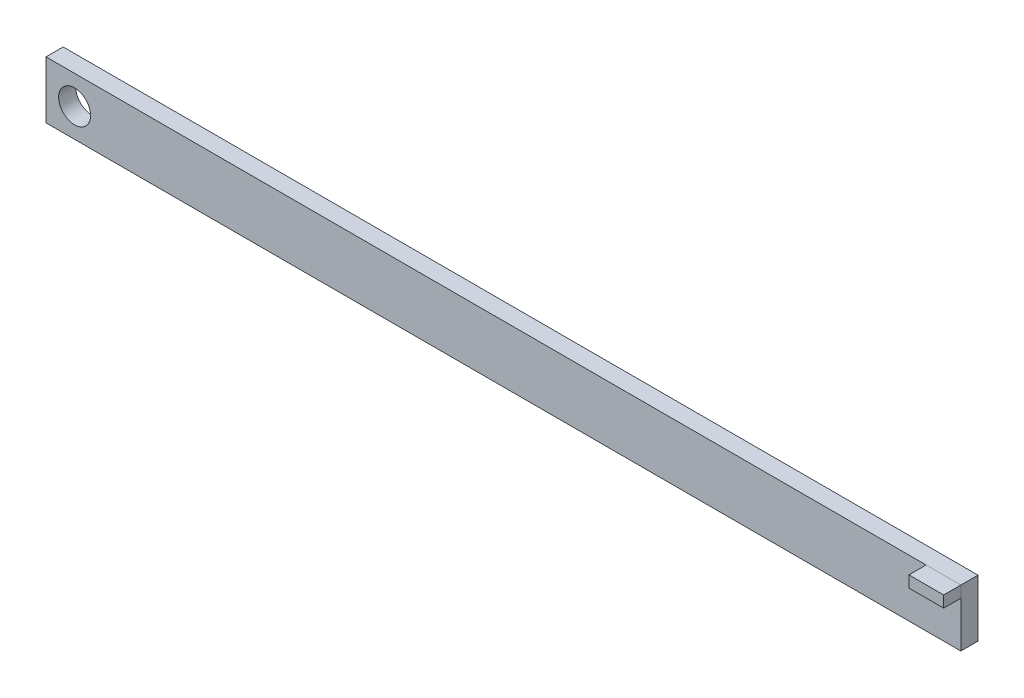
ISO-10303-21;
HEADER;
FILE_DESCRIPTION(('STEP AP214'),'2;1');
FILE_NAME('part.step','',(''),(''),'','','');
FILE_SCHEMA(('AUTOMOTIVE_DESIGN { 1 0 10303 214 1 1 1 1 }'));
ENDSEC;
DATA;
#1=APPLICATION_CONTEXT('core data for automotive mechanical design processes');
#2=APPLICATION_PROTOCOL_DEFINITION('international standard','automotive_design',2000,#1);
#3=PRODUCT_CONTEXT('',#1,'mechanical');
#4=PRODUCT('Part','Part','',(#3));
#5=PRODUCT_RELATED_PRODUCT_CATEGORY('part','',(#4));
#6=PRODUCT_DEFINITION_FORMATION('','',#4);
#7=PRODUCT_DEFINITION_CONTEXT('part definition',#1,'design');
#8=PRODUCT_DEFINITION('design','',#6,#7);
#9=PRODUCT_DEFINITION_SHAPE('','',#8);
#10=(LENGTH_UNIT() NAMED_UNIT(*) SI_UNIT(.MILLI.,.METRE.));
#11=(NAMED_UNIT(*) PLANE_ANGLE_UNIT() SI_UNIT($,.RADIAN.));
#12=(NAMED_UNIT(*) SI_UNIT($,.STERADIAN.) SOLID_ANGLE_UNIT());
#13=UNCERTAINTY_MEASURE_WITH_UNIT(LENGTH_MEASURE(1.E-05),#10,'distance_accuracy_value','');
#14=(GEOMETRIC_REPRESENTATION_CONTEXT(3) GLOBAL_UNCERTAINTY_ASSIGNED_CONTEXT((#13)) GLOBAL_UNIT_ASSIGNED_CONTEXT((#10,
#11,#12)) REPRESENTATION_CONTEXT('',''));
#15=CARTESIAN_POINT('',(0.,0.,0.));
#16=DIRECTION('',(0.,0.,1.));
#17=DIRECTION('',(1.,0.,0.));
#18=AXIS2_PLACEMENT_3D('',#15,#16,#17);
#19=CARTESIAN_POINT('',(0.,26.,95.9));
#20=DIRECTION('',(0.,-1.,0.));
#21=DIRECTION('',(1.,0.,0.));
#22=AXIS2_PLACEMENT_3D('',#19,#20,#21);
#23=PLANE('',#22);
#24=DIRECTION('',(-1.,0.,0.));
#25=VECTOR('',#24,1.);
#26=CARTESIAN_POINT('',(0.,26.,92.9));
#27=LINE('',#26,#25);
#28=CARTESIAN_POINT('',(220.,26.,92.9));
#29=VERTEX_POINT('',#28);
#30=CARTESIAN_POINT('',(213.922074633376,26.,92.9));
#31=VERTEX_POINT('',#30);
#32=EDGE_CURVE('E108',#29,#31,#27,.T.);
#33=ORIENTED_EDGE('',*,*,#32,.T.);
#34=DIRECTION('',(0.,0.,-1.));
#35=VECTOR('',#34,1.);
#36=CARTESIAN_POINT('',(213.922074633376,26.,95.9));
#37=LINE('',#36,#35);
#38=CARTESIAN_POINT('',(213.922074633376,26.,95.9));
#39=VERTEX_POINT('',#38);
#40=EDGE_CURVE('E12',#39,#31,#37,.T.);
#41=ORIENTED_EDGE('',*,*,#40,.F.);
#42=DIRECTION('',(-1.,0.,0.));
#43=VECTOR('',#42,1.);
#44=CARTESIAN_POINT('',(0.,26.,95.9));
#45=LINE('',#44,#43);
#46=CARTESIAN_POINT('',(220.,26.,95.9));
#47=VERTEX_POINT('',#46);
#48=EDGE_CURVE('E96',#47,#39,#45,.T.);
#49=ORIENTED_EDGE('',*,*,#48,.F.);
#50=DIRECTION('',(0.,0.,-1.));
#51=VECTOR('',#50,1.);
#52=CARTESIAN_POINT('',(220.,26.,95.9));
#53=LINE('',#52,#51);
#54=EDGE_CURVE('E104',#47,#29,#53,.T.);
#55=ORIENTED_EDGE('',*,*,#54,.T.);
#56=EDGE_LOOP('',(#33,#41,#49,#55));
#57=FACE_BOUND('',#56,.T.);
#58=ADVANCED_FACE('F45',(#57),#23,.F.);
#59=CARTESIAN_POINT('',(213.922074633376,0.,95.9));
#60=DIRECTION('',(1.,0.,0.));
#61=DIRECTION('',(0.,0.,-1.));
#62=AXIS2_PLACEMENT_3D('',#59,#60,#61);
#63=PLANE('',#62);
#64=DIRECTION('',(0.,-1.,0.));
#65=VECTOR('',#64,1.);
#66=CARTESIAN_POINT('',(213.922074633376,0.,92.9));
#67=LINE('',#66,#65);
#68=CARTESIAN_POINT('',(213.922074633376,24.,92.9));
#69=VERTEX_POINT('',#68);
#70=EDGE_CURVE('E100',#31,#69,#67,.T.);
#71=ORIENTED_EDGE('',*,*,#70,.T.);
#72=DIRECTION('',(0.,0.,-1.));
#73=VECTOR('',#72,1.);
#74=CARTESIAN_POINT('',(213.922074633376,24.,95.9));
#75=LINE('',#74,#73);
#76=CARTESIAN_POINT('',(213.922074633376,24.,95.9));
#77=VERTEX_POINT('',#76);
#78=EDGE_CURVE('E53',#77,#69,#75,.T.);
#79=ORIENTED_EDGE('',*,*,#78,.F.);
#80=DIRECTION('',(0.,-1.,0.));
#81=VECTOR('',#80,1.);
#82=CARTESIAN_POINT('',(213.922074633376,0.,95.9));
#83=LINE('',#82,#81);
#84=EDGE_CURVE('E91',#39,#77,#83,.T.);
#85=ORIENTED_EDGE('',*,*,#84,.F.);
#86=ORIENTED_EDGE('',*,*,#40,.T.);
#87=EDGE_LOOP('',(#71,#79,#85,#86));
#88=FACE_BOUND('',#87,.T.);
#89=ADVANCED_FACE('F99',(#88),#63,.F.);
#90=CARTESIAN_POINT('',(0.,24.,95.9));
#91=DIRECTION('',(0.,1.,0.));
#92=DIRECTION('',(0.,0.,1.));
#93=AXIS2_PLACEMENT_3D('',#90,#91,#92);
#94=PLANE('',#93);
#95=DIRECTION('',(1.,0.,0.));
#96=VECTOR('',#95,1.);
#97=CARTESIAN_POINT('',(0.,24.,92.9));
#98=LINE('',#97,#96);
#99=CARTESIAN_POINT('',(220.,24.,92.9));
#100=VERTEX_POINT('',#99);
#101=EDGE_CURVE('E78',#69,#100,#98,.T.);
#102=ORIENTED_EDGE('',*,*,#101,.T.);
#103=DIRECTION('',(0.,0.,-1.));
#104=VECTOR('',#103,1.);
#105=CARTESIAN_POINT('',(220.,24.,95.9));
#106=LINE('',#105,#104);
#107=CARTESIAN_POINT('',(220.,24.,95.9));
#108=VERTEX_POINT('',#107);
#109=EDGE_CURVE('E101',#108,#100,#106,.T.);
#110=ORIENTED_EDGE('',*,*,#109,.F.);
#111=DIRECTION('',(1.,0.,0.));
#112=VECTOR('',#111,1.);
#113=CARTESIAN_POINT('',(0.,24.,95.9));
#114=LINE('',#113,#112);
#115=EDGE_CURVE('E94',#77,#108,#114,.T.);
#116=ORIENTED_EDGE('',*,*,#115,.F.);
#117=ORIENTED_EDGE('',*,*,#78,.T.);
#118=EDGE_LOOP('',(#102,#110,#116,#117));
#119=FACE_BOUND('',#118,.T.);
#120=ADVANCED_FACE('F102',(#119),#94,.F.);
#121=CARTESIAN_POINT('',(220.,0.,95.9));
#122=DIRECTION('',(-1.,0.,0.));
#123=DIRECTION('',(0.,0.,1.));
#124=AXIS2_PLACEMENT_3D('',#121,#122,#123);
#125=PLANE('',#124);
#126=DIRECTION('',(0.,1.,0.));
#127=VECTOR('',#126,1.);
#128=CARTESIAN_POINT('',(220.,0.,92.9));
#129=LINE('',#128,#127);
#130=EDGE_CURVE('E84',#100,#29,#129,.T.);
#131=ORIENTED_EDGE('',*,*,#130,.T.);
#132=ORIENTED_EDGE('',*,*,#54,.F.);
#133=DIRECTION('',(0.,1.,0.));
#134=VECTOR('',#133,1.);
#135=CARTESIAN_POINT('',(220.,0.,95.9));
#136=LINE('',#135,#134);
#137=EDGE_CURVE('E61',#108,#47,#136,.T.);
#138=ORIENTED_EDGE('',*,*,#137,.F.);
#139=ORIENTED_EDGE('',*,*,#109,.T.);
#140=EDGE_LOOP('',(#131,#132,#138,#139));
#141=FACE_BOUND('',#140,.T.);
#142=ADVANCED_FACE('F115',(#141),#125,.F.);
#143=CARTESIAN_POINT('',(0.,0.,95.9));
#144=DIRECTION('',(0.,0.,1.));
#145=DIRECTION('',(1.,0.,0.));
#146=AXIS2_PLACEMENT_3D('',#143,#144,#145);
#147=PLANE('',#146);
#148=ORIENTED_EDGE('',*,*,#48,.T.);
#149=ORIENTED_EDGE('',*,*,#84,.T.);
#150=ORIENTED_EDGE('',*,*,#115,.T.);
#151=ORIENTED_EDGE('',*,*,#137,.T.);
#152=EDGE_LOOP('',(#148,#149,#150,#151));
#153=FACE_BOUND('',#152,.T.);
#154=ADVANCED_FACE('F92',(#153),#147,.T.);
#155=CARTESIAN_POINT('',(0.,0.,92.9));
#156=DIRECTION('',(0.,0.,1.));
#157=DIRECTION('',(1.,0.,0.));
#158=AXIS2_PLACEMENT_3D('',#155,#156,#157);
#159=PLANE('',#158);
#160=ORIENTED_EDGE('',*,*,#32,.F.);
#161=ORIENTED_EDGE('',*,*,#130,.F.);
#162=ORIENTED_EDGE('',*,*,#101,.F.);
#163=ORIENTED_EDGE('',*,*,#70,.F.);
#164=EDGE_LOOP('',(#160,#161,#162,#163));
#165=FACE_BOUND('',#164,.T.);
#166=ADVANCED_FACE('F118',(#165),#159,.F.);
#167=CLOSED_SHELL('',(#58,#89,#120,#142,#154,#166));
#168=MANIFOLD_SOLID_BREP('B2',#167);
#169=CARTESIAN_POINT('',(0.,0.,92.9));
#170=DIRECTION('',(0.,0.,-1.));
#171=DIRECTION('',(-1.,0.,0.));
#172=AXIS2_PLACEMENT_3D('',#169,#170,#171);
#173=PLANE('',#172);
#174=DIRECTION('',(0.,1.,0.));
#175=VECTOR('',#174,1.);
#176=CARTESIAN_POINT('',(220.,16.,92.9));
#177=LINE('',#176,#175);
#178=CARTESIAN_POINT('',(220.,16.,92.9));
#179=VERTEX_POINT('',#178);
#180=CARTESIAN_POINT('',(220.,26.,92.9));
#181=VERTEX_POINT('',#180);
#182=EDGE_CURVE('E226',#179,#181,#177,.T.);
#183=ORIENTED_EDGE('',*,*,#182,.T.);
#184=DIRECTION('',(-1.,0.,0.));
#185=VECTOR('',#184,1.);
#186=CARTESIAN_POINT('',(65.,26.,92.9));
#187=LINE('',#186,#185);
#188=CARTESIAN_POINT('',(60.,26.,92.9));
#189=VERTEX_POINT('',#188);
#190=EDGE_CURVE('E220',#181,#189,#187,.T.);
#191=ORIENTED_EDGE('',*,*,#190,.T.);
#192=DIRECTION('',(0.,-1.,0.));
#193=VECTOR('',#192,1.);
#194=CARTESIAN_POINT('',(60.,16.,92.9));
#195=LINE('',#194,#193);
#196=CARTESIAN_POINT('',(60.,16.,92.9));
#197=VERTEX_POINT('',#196);
#198=EDGE_CURVE('E223',#189,#197,#195,.T.);
#199=ORIENTED_EDGE('',*,*,#198,.T.);
#200=DIRECTION('',(1.,0.,0.));
#201=VECTOR('',#200,1.);
#202=CARTESIAN_POINT('',(65.,16.,92.9));
#203=LINE('',#202,#201);
#204=EDGE_CURVE('E192',#197,#179,#203,.T.);
#205=ORIENTED_EDGE('',*,*,#204,.T.);
#206=EDGE_LOOP('',(#183,#191,#199,#205));
#207=FACE_BOUND('',#206,.T.);
#208=CARTESIAN_POINT('',(65.,21.,92.9));
#209=DIRECTION('',(0.,0.,1.));
#210=DIRECTION('',(1.,0.,0.));
#211=AXIS2_PLACEMENT_3D('',#208,#209,#210);
#212=CIRCLE('',#211,2.8);
#213=CARTESIAN_POINT('',(67.8,21.,92.9));
#214=VERTEX_POINT('',#213);
#215=EDGE_CURVE('E243',#214,#214,#212,.T.);
#216=ORIENTED_EDGE('',*,*,#215,.F.);
#217=EDGE_LOOP('',(#216));
#218=FACE_BOUND('',#217,.T.);
#219=ADVANCED_FACE('F175',(#207,#218),#173,.F.);
#220=CARTESIAN_POINT('',(0.,0.,89.9));
#221=DIRECTION('',(0.,0.,-1.));
#222=DIRECTION('',(-1.,0.,0.));
#223=AXIS2_PLACEMENT_3D('',#220,#221,#222);
#224=PLANE('',#223);
#225=DIRECTION('',(0.,1.,0.));
#226=VECTOR('',#225,1.);
#227=CARTESIAN_POINT('',(220.,16.,89.9));
#228=LINE('',#227,#226);
#229=CARTESIAN_POINT('',(220.,16.,89.9));
#230=VERTEX_POINT('',#229);
#231=CARTESIAN_POINT('',(220.,26.,89.9));
#232=VERTEX_POINT('',#231);
#233=EDGE_CURVE('E240',#230,#232,#228,.T.);
#234=ORIENTED_EDGE('',*,*,#233,.F.);
#235=DIRECTION('',(1.,0.,0.));
#236=VECTOR('',#235,1.);
#237=CARTESIAN_POINT('',(65.,16.,89.9));
#238=LINE('',#237,#236);
#239=CARTESIAN_POINT('',(60.,16.,89.9));
#240=VERTEX_POINT('',#239);
#241=EDGE_CURVE('E209',#240,#230,#238,.T.);
#242=ORIENTED_EDGE('',*,*,#241,.F.);
#243=DIRECTION('',(0.,-1.,0.));
#244=VECTOR('',#243,1.);
#245=CARTESIAN_POINT('',(60.,16.,89.9));
#246=LINE('',#245,#244);
#247=CARTESIAN_POINT('',(60.,26.,89.9));
#248=VERTEX_POINT('',#247);
#249=EDGE_CURVE('E245',#248,#240,#246,.T.);
#250=ORIENTED_EDGE('',*,*,#249,.F.);
#251=DIRECTION('',(-1.,0.,0.));
#252=VECTOR('',#251,1.);
#253=CARTESIAN_POINT('',(65.,26.,89.9));
#254=LINE('',#253,#252);
#255=EDGE_CURVE('E231',#232,#248,#254,.T.);
#256=ORIENTED_EDGE('',*,*,#255,.F.);
#257=EDGE_LOOP('',(#234,#242,#250,#256));
#258=FACE_BOUND('',#257,.T.);
#259=CARTESIAN_POINT('',(65.,21.,89.9));
#260=DIRECTION('',(0.,0.,1.));
#261=DIRECTION('',(1.,0.,0.));
#262=AXIS2_PLACEMENT_3D('',#259,#260,#261);
#263=CIRCLE('',#262,2.8);
#264=CARTESIAN_POINT('',(67.8,21.,89.9));
#265=VERTEX_POINT('',#264);
#266=EDGE_CURVE('E252',#265,#265,#263,.T.);
#267=ORIENTED_EDGE('',*,*,#266,.T.);
#268=EDGE_LOOP('',(#267));
#269=FACE_BOUND('',#268,.T.);
#270=ADVANCED_FACE('F260',(#258,#269),#224,.T.);
#271=CARTESIAN_POINT('',(220.,16.,92.9));
#272=DIRECTION('',(-1.,0.,0.));
#273=DIRECTION('',(0.,0.,1.));
#274=AXIS2_PLACEMENT_3D('',#271,#272,#273);
#275=PLANE('',#274);
#276=ORIENTED_EDGE('',*,*,#233,.T.);
#277=DIRECTION('',(0.,0.,-1.));
#278=VECTOR('',#277,1.);
#279=CARTESIAN_POINT('',(220.,26.,92.9));
#280=LINE('',#279,#278);
#281=EDGE_CURVE('E43',#181,#232,#280,.T.);
#282=ORIENTED_EDGE('',*,*,#281,.F.);
#283=ORIENTED_EDGE('',*,*,#182,.F.);
#284=DIRECTION('',(0.,0.,-1.));
#285=VECTOR('',#284,1.);
#286=CARTESIAN_POINT('',(220.,16.,92.9));
#287=LINE('',#286,#285);
#288=EDGE_CURVE('E236',#179,#230,#287,.T.);
#289=ORIENTED_EDGE('',*,*,#288,.T.);
#290=EDGE_LOOP('',(#276,#282,#283,#289));
#291=FACE_BOUND('',#290,.T.);
#292=ADVANCED_FACE('F177',(#291),#275,.F.);
#293=CARTESIAN_POINT('',(65.,26.,92.9));
#294=DIRECTION('',(0.,-1.,0.));
#295=DIRECTION('',(1.,0.,0.));
#296=AXIS2_PLACEMENT_3D('',#293,#294,#295);
#297=PLANE('',#296);
#298=ORIENTED_EDGE('',*,*,#255,.T.);
#299=DIRECTION('',(0.,0.,-1.));
#300=VECTOR('',#299,1.);
#301=CARTESIAN_POINT('',(60.,26.,92.9));
#302=LINE('',#301,#300);
#303=EDGE_CURVE('E184',#189,#248,#302,.T.);
#304=ORIENTED_EDGE('',*,*,#303,.F.);
#305=ORIENTED_EDGE('',*,*,#190,.F.);
#306=ORIENTED_EDGE('',*,*,#281,.T.);
#307=EDGE_LOOP('',(#298,#304,#305,#306));
#308=FACE_BOUND('',#307,.T.);
#309=ADVANCED_FACE('F230',(#308),#297,.F.);
#310=CARTESIAN_POINT('',(60.,16.,92.9));
#311=DIRECTION('',(1.,0.,0.));
#312=DIRECTION('',(0.,1.,0.));
#313=AXIS2_PLACEMENT_3D('',#310,#311,#312);
#314=PLANE('',#313);
#315=ORIENTED_EDGE('',*,*,#249,.T.);
#316=DIRECTION('',(0.,0.,-1.));
#317=VECTOR('',#316,1.);
#318=CARTESIAN_POINT('',(60.,16.,92.9));
#319=LINE('',#318,#317);
#320=EDGE_CURVE('E233',#197,#240,#319,.T.);
#321=ORIENTED_EDGE('',*,*,#320,.F.);
#322=ORIENTED_EDGE('',*,*,#198,.F.);
#323=ORIENTED_EDGE('',*,*,#303,.T.);
#324=EDGE_LOOP('',(#315,#321,#322,#323));
#325=FACE_BOUND('',#324,.T.);
#326=ADVANCED_FACE('F234',(#325),#314,.F.);
#327=CARTESIAN_POINT('',(65.,16.,92.9));
#328=DIRECTION('',(0.,1.,0.));
#329=DIRECTION('',(0.,0.,1.));
#330=AXIS2_PLACEMENT_3D('',#327,#328,#329);
#331=PLANE('',#330);
#332=ORIENTED_EDGE('',*,*,#241,.T.);
#333=ORIENTED_EDGE('',*,*,#288,.F.);
#334=ORIENTED_EDGE('',*,*,#204,.F.);
#335=ORIENTED_EDGE('',*,*,#320,.T.);
#336=EDGE_LOOP('',(#332,#333,#334,#335));
#337=FACE_BOUND('',#336,.T.);
#338=ADVANCED_FACE('F249',(#337),#331,.F.);
#339=CARTESIAN_POINT('',(65.,21.,92.9));
#340=DIRECTION('',(0.,0.,-1.));
#341=DIRECTION('',(-1.,0.,0.));
#342=AXIS2_PLACEMENT_3D('',#339,#340,#341);
#343=CYLINDRICAL_SURFACE('',#342,2.8);
#344=ORIENTED_EDGE('',*,*,#266,.F.);
#345=EDGE_LOOP('',(#344));
#346=FACE_BOUND('',#345,.T.);
#347=ORIENTED_EDGE('',*,*,#215,.T.);
#348=EDGE_LOOP('',(#347));
#349=FACE_BOUND('',#348,.T.);
#350=ADVANCED_FACE('F258',(#346,#349),#343,.F.);
#351=CLOSED_SHELL('',(#219,#270,#292,#309,#326,#338,#350));
#352=MANIFOLD_SOLID_BREP('B6',#351);
#353=ADVANCED_BREP_SHAPE_REPRESENTATION('',(#18,#168,#352),#14);
#354=SHAPE_DEFINITION_REPRESENTATION(#9,#353);
ENDSEC;
END-ISO-10303-21;
